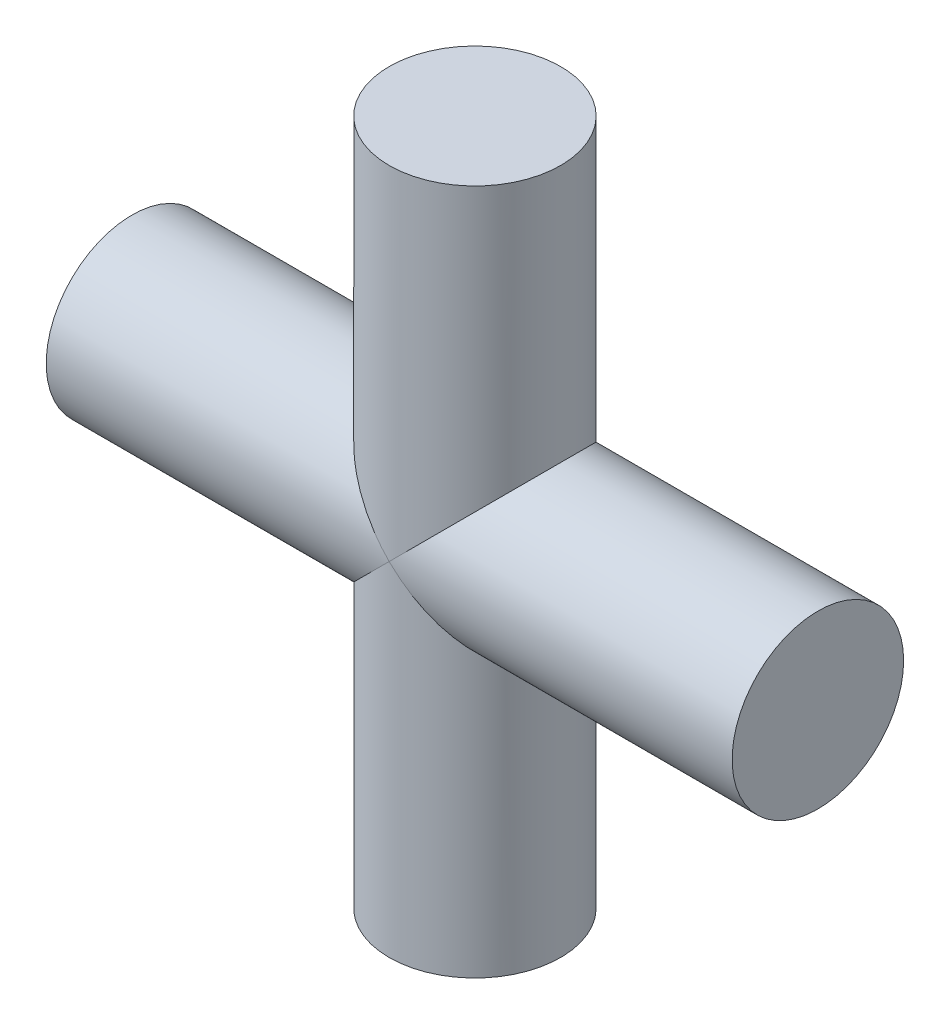
ISO-10303-21;
HEADER;
FILE_DESCRIPTION(('STEP AP214'),'2;1');
FILE_NAME('part.step','',(''),(''),'','','');
FILE_SCHEMA(('AUTOMOTIVE_DESIGN { 1 0 10303 214 1 1 1 1 }'));
ENDSEC;
DATA;
#1=APPLICATION_CONTEXT('core data for automotive mechanical design processes');
#2=APPLICATION_PROTOCOL_DEFINITION('international standard','automotive_design',2000,#1);
#3=PRODUCT_CONTEXT('',#1,'mechanical');
#4=PRODUCT('Part','Part','',(#3));
#5=PRODUCT_RELATED_PRODUCT_CATEGORY('part','',(#4));
#6=PRODUCT_DEFINITION_FORMATION('','',#4);
#7=PRODUCT_DEFINITION_CONTEXT('part definition',#1,'design');
#8=PRODUCT_DEFINITION('design','',#6,#7);
#9=PRODUCT_DEFINITION_SHAPE('','',#8);
#10=(LENGTH_UNIT() NAMED_UNIT(*) SI_UNIT(.MILLI.,.METRE.));
#11=(NAMED_UNIT(*) PLANE_ANGLE_UNIT() SI_UNIT($,.RADIAN.));
#12=(NAMED_UNIT(*) SI_UNIT($,.STERADIAN.) SOLID_ANGLE_UNIT());
#13=UNCERTAINTY_MEASURE_WITH_UNIT(LENGTH_MEASURE(1.E-05),#10,'distance_accuracy_value','');
#14=(GEOMETRIC_REPRESENTATION_CONTEXT(3) GLOBAL_UNCERTAINTY_ASSIGNED_CONTEXT((#13)) GLOBAL_UNIT_ASSIGNED_CONTEXT((#10,
#11,#12)) REPRESENTATION_CONTEXT('',''));
#15=CARTESIAN_POINT('',(0.,0.,0.));
#16=DIRECTION('',(0.,0.,1.));
#17=DIRECTION('',(1.,0.,0.));
#18=AXIS2_PLACEMENT_3D('',#15,#16,#17);
#19=CARTESIAN_POINT('',(-20.,0.,0.));
#20=DIRECTION('',(1.,0.,0.));
#21=DIRECTION('',(0.,0.,-1.));
#22=AXIS2_PLACEMENT_3D('',#19,#20,#21);
#23=CYLINDRICAL_SURFACE('',#22,5.);
#24=CARTESIAN_POINT('',(0.,0.,0.));
#25=DIRECTION('',(0.707106781186547,0.707106781186547,0.));
#26=DIRECTION('',(0.707106781186547,-0.707106781186547,0.));
#27=AXIS2_PLACEMENT_3D('',#24,#25,#26);
#28=ELLIPSE('',#27,7.07106781186547,5.);
#29=CARTESIAN_POINT('',(0.,0.,-5.));
#30=VERTEX_POINT('',#29);
#31=CARTESIAN_POINT('',(0.,0.,5.));
#32=VERTEX_POINT('',#31);
#33=EDGE_CURVE('E43',#30,#32,#28,.T.);
#34=ORIENTED_EDGE('',*,*,#33,.F.);
#35=CARTESIAN_POINT('',(0.,0.,0.));
#36=DIRECTION('',(0.707106781186547,-0.707106781186547,0.));
#37=DIRECTION('',(0.707106781186547,0.707106781186547,0.));
#38=AXIS2_PLACEMENT_3D('',#35,#36,#37);
#39=ELLIPSE('',#38,7.07106781186547,5.);
#40=EDGE_CURVE('E55',#32,#30,#39,.T.);
#41=ORIENTED_EDGE('',*,*,#40,.F.);
#42=EDGE_LOOP('',(#34,#41));
#43=FACE_BOUND('',#42,.T.);
#44=CARTESIAN_POINT('',(-20.,0.,0.));
#45=DIRECTION('',(1.,0.,0.));
#46=DIRECTION('',(0.,0.,-1.));
#47=AXIS2_PLACEMENT_3D('',#44,#45,#46);
#48=CIRCLE('',#47,5.);
#49=CARTESIAN_POINT('',(-20.,0.,-5.));
#50=VERTEX_POINT('',#49);
#51=EDGE_CURVE('E62',#50,#50,#48,.T.);
#52=ORIENTED_EDGE('',*,*,#51,.T.);
#53=EDGE_LOOP('',(#52));
#54=FACE_BOUND('',#53,.T.);
#55=ADVANCED_FACE('F36',(#43,#54),#23,.T.);
#56=CARTESIAN_POINT('',(-20.,0.,0.));
#57=DIRECTION('',(1.,0.,0.));
#58=DIRECTION('',(0.,0.,-1.));
#59=AXIS2_PLACEMENT_3D('',#56,#57,#58);
#60=PLANE('',#59);
#61=ORIENTED_EDGE('',*,*,#51,.F.);
#62=EDGE_LOOP('',(#61));
#63=FACE_BOUND('',#62,.T.);
#64=ADVANCED_FACE('F85',(#63),#60,.F.);
#65=CARTESIAN_POINT('',(0.,20.,0.));
#66=DIRECTION('',(0.,1.,0.));
#67=DIRECTION('',(0.,0.,1.));
#68=AXIS2_PLACEMENT_3D('',#65,#66,#67);
#69=PLANE('',#68);
#70=CARTESIAN_POINT('',(0.,20.,0.));
#71=DIRECTION('',(0.,1.,0.));
#72=DIRECTION('',(0.,0.,1.));
#73=AXIS2_PLACEMENT_3D('',#70,#71,#72);
#74=CIRCLE('',#73,5.);
#75=CARTESIAN_POINT('',(0.,20.,5.));
#76=VERTEX_POINT('',#75);
#77=EDGE_CURVE('E75',#76,#76,#74,.T.);
#78=ORIENTED_EDGE('',*,*,#77,.T.);
#79=EDGE_LOOP('',(#78));
#80=FACE_BOUND('',#79,.T.);
#81=ADVANCED_FACE('F87',(#80),#69,.T.);
#82=CARTESIAN_POINT('',(0.,-20.,0.));
#83=DIRECTION('',(0.,1.,0.));
#84=DIRECTION('',(0.,0.,1.));
#85=AXIS2_PLACEMENT_3D('',#82,#83,#84);
#86=CYLINDRICAL_SURFACE('',#85,5.);
#87=ORIENTED_EDGE('',*,*,#77,.F.);
#88=EDGE_LOOP('',(#87));
#89=FACE_BOUND('',#88,.T.);
#90=CARTESIAN_POINT('',(0.,0.,0.));
#91=DIRECTION('',(0.707106781186547,-0.707106781186547,0.));
#92=DIRECTION('',(0.707106781186547,0.707106781186547,0.));
#93=AXIS2_PLACEMENT_3D('',#90,#91,#92);
#94=ELLIPSE('',#93,7.07106781186547,5.);
#95=EDGE_CURVE('E49',#32,#30,#94,.F.);
#96=ORIENTED_EDGE('',*,*,#95,.T.);
#97=ORIENTED_EDGE('',*,*,#33,.T.);
#98=EDGE_LOOP('',(#96,#97));
#99=FACE_BOUND('',#98,.T.);
#100=ADVANCED_FACE('F64',(#89,#99),#86,.T.);
#101=CARTESIAN_POINT('',(20.,0.,0.));
#102=DIRECTION('',(1.,0.,0.));
#103=DIRECTION('',(0.,0.,-1.));
#104=AXIS2_PLACEMENT_3D('',#101,#102,#103);
#105=PLANE('',#104);
#106=CARTESIAN_POINT('',(20.,0.,0.));
#107=DIRECTION('',(1.,0.,0.));
#108=DIRECTION('',(0.,0.,-1.));
#109=AXIS2_PLACEMENT_3D('',#106,#107,#108);
#110=CIRCLE('',#109,5.);
#111=CARTESIAN_POINT('',(20.,0.,-5.));
#112=VERTEX_POINT('',#111);
#113=EDGE_CURVE('E74',#112,#112,#110,.T.);
#114=ORIENTED_EDGE('',*,*,#113,.T.);
#115=EDGE_LOOP('',(#114));
#116=FACE_BOUND('',#115,.T.);
#117=ADVANCED_FACE('F95',(#116),#105,.T.);
#118=CARTESIAN_POINT('',(0.,0.,0.));
#119=DIRECTION('',(0.707106781186547,0.707106781186547,0.));
#120=DIRECTION('',(0.707106781186547,-0.707106781186547,0.));
#121=AXIS2_PLACEMENT_3D('',#118,#119,#120);
#122=ELLIPSE('',#121,7.07106781186547,5.);
#123=EDGE_CURVE('E11',#30,#32,#122,.F.);
#124=ORIENTED_EDGE('',*,*,#123,.F.);
#125=ORIENTED_EDGE('',*,*,#95,.F.);
#126=EDGE_LOOP('',(#124,#125));
#127=FACE_BOUND('',#126,.T.);
#128=ORIENTED_EDGE('',*,*,#113,.F.);
#129=EDGE_LOOP('',(#128));
#130=FACE_BOUND('',#129,.T.);
#131=ADVANCED_FACE('F60',(#127,#130),#23,.T.);
#132=ORIENTED_EDGE('',*,*,#40,.T.);
#133=ORIENTED_EDGE('',*,*,#123,.T.);
#134=EDGE_LOOP('',(#132,#133));
#135=FACE_BOUND('',#134,.T.);
#136=CARTESIAN_POINT('',(0.,-20.,0.));
#137=DIRECTION('',(0.,1.,0.));
#138=DIRECTION('',(0.,0.,1.));
#139=AXIS2_PLACEMENT_3D('',#136,#137,#138);
#140=CIRCLE('',#139,5.);
#141=CARTESIAN_POINT('',(0.,-20.,5.));
#142=VERTEX_POINT('',#141);
#143=EDGE_CURVE('E72',#142,#142,#140,.T.);
#144=ORIENTED_EDGE('',*,*,#143,.T.);
#145=EDGE_LOOP('',(#144));
#146=FACE_BOUND('',#145,.T.);
#147=ADVANCED_FACE('F65',(#135,#146),#86,.T.);
#148=CARTESIAN_POINT('',(0.,-20.,0.));
#149=DIRECTION('',(0.,1.,0.));
#150=DIRECTION('',(0.,0.,1.));
#151=AXIS2_PLACEMENT_3D('',#148,#149,#150);
#152=PLANE('',#151);
#153=ORIENTED_EDGE('',*,*,#143,.F.);
#154=EDGE_LOOP('',(#153));
#155=FACE_BOUND('',#154,.T.);
#156=ADVANCED_FACE('F68',(#155),#152,.F.);
#157=CLOSED_SHELL('',(#55,#64,#81,#100,#117,#131,#147,#156));
#158=MANIFOLD_SOLID_BREP('B2',#157);
#159=ADVANCED_BREP_SHAPE_REPRESENTATION('',(#18,#158),#14);
#160=SHAPE_DEFINITION_REPRESENTATION(#9,#159);
ENDSEC;
END-ISO-10303-21;
